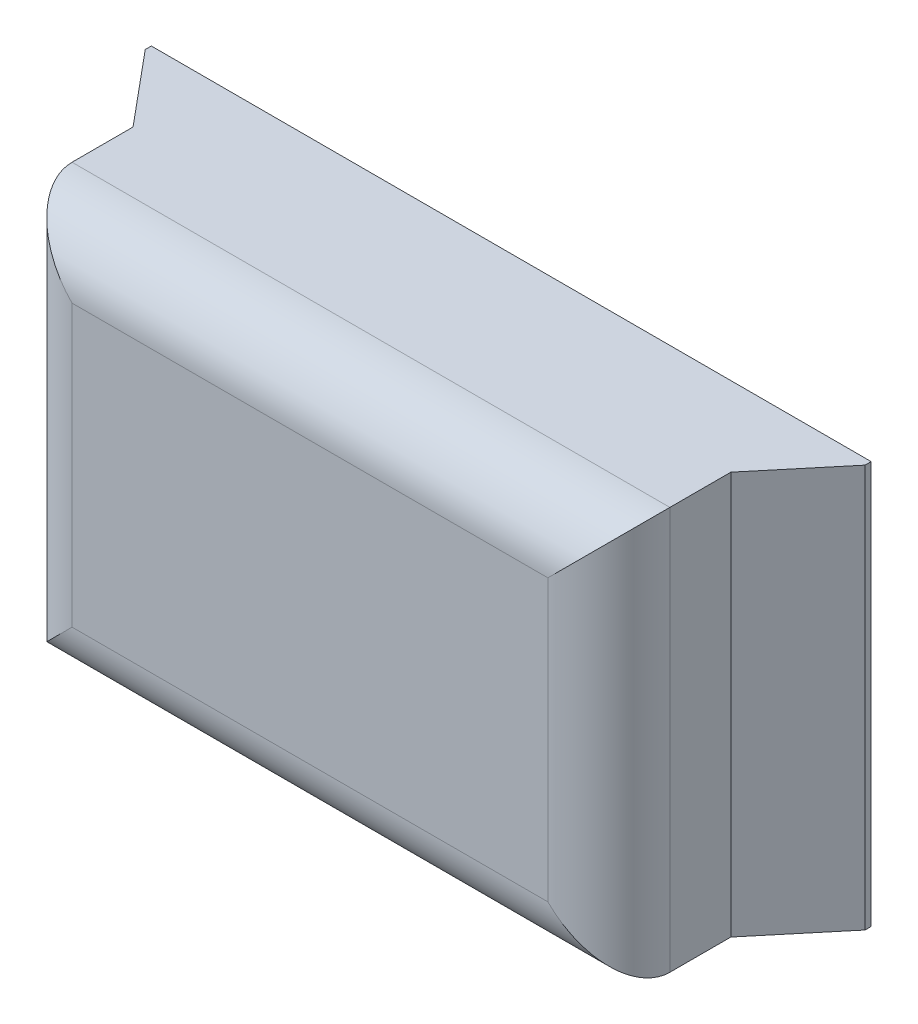
ISO-10303-21;
HEADER;
FILE_DESCRIPTION(('STEP AP214'),'2;1');
FILE_NAME('part.step','',(''),(''),'','','');
FILE_SCHEMA(('AUTOMOTIVE_DESIGN { 1 0 10303 214 1 1 1 1 }'));
ENDSEC;
DATA;
#1=APPLICATION_CONTEXT('core data for automotive mechanical design processes');
#2=APPLICATION_PROTOCOL_DEFINITION('international standard','automotive_design',2000,#1);
#3=PRODUCT_CONTEXT('',#1,'mechanical');
#4=PRODUCT('Part','Part','',(#3));
#5=PRODUCT_RELATED_PRODUCT_CATEGORY('part','',(#4));
#6=PRODUCT_DEFINITION_FORMATION('','',#4);
#7=PRODUCT_DEFINITION_CONTEXT('part definition',#1,'design');
#8=PRODUCT_DEFINITION('design','',#6,#7);
#9=PRODUCT_DEFINITION_SHAPE('','',#8);
#10=(LENGTH_UNIT() NAMED_UNIT(*) SI_UNIT(.MILLI.,.METRE.));
#11=(NAMED_UNIT(*) PLANE_ANGLE_UNIT() SI_UNIT($,.RADIAN.));
#12=(NAMED_UNIT(*) SI_UNIT($,.STERADIAN.) SOLID_ANGLE_UNIT());
#13=UNCERTAINTY_MEASURE_WITH_UNIT(LENGTH_MEASURE(1.E-05),#10,'distance_accuracy_value','');
#14=(GEOMETRIC_REPRESENTATION_CONTEXT(3) GLOBAL_UNCERTAINTY_ASSIGNED_CONTEXT((#13)) GLOBAL_UNIT_ASSIGNED_CONTEXT((#10,
#11,#12)) REPRESENTATION_CONTEXT('',''));
#15=CARTESIAN_POINT('',(0.,0.,0.));
#16=DIRECTION('',(0.,0.,1.));
#17=DIRECTION('',(1.,0.,0.));
#18=AXIS2_PLACEMENT_3D('',#15,#16,#17);
#19=CARTESIAN_POINT('',(-13.7543906913886,3.3,7.29759578596647));
#20=DIRECTION('',(-1.,0.,0.));
#21=DIRECTION('',(0.,0.,1.));
#22=AXIS2_PLACEMENT_3D('',#19,#20,#21);
#23=PLANE('',#22);
#24=DIRECTION('',(0.,0.,-1.));
#25=VECTOR('',#24,1.);
#26=CARTESIAN_POINT('',(-13.7543906913886,0.,7.29759578596647));
#27=LINE('',#26,#25);
#28=CARTESIAN_POINT('',(-13.7543906913886,0.,7.29759578596647));
#29=VERTEX_POINT('',#28);
#30=CARTESIAN_POINT('',(-13.7543906913886,0.,7.24759578596647));
#31=VERTEX_POINT('',#30);
#32=EDGE_CURVE('E218',#29,#31,#27,.T.);
#33=ORIENTED_EDGE('',*,*,#32,.T.);
#34=DIRECTION('',(0.,-1.,0.));
#35=VECTOR('',#34,1.);
#36=CARTESIAN_POINT('',(-13.7543906913886,3.3,7.24759578596647));
#37=LINE('',#36,#35);
#38=CARTESIAN_POINT('',(-13.7543906913886,3.3,7.24759578596647));
#39=VERTEX_POINT('',#38);
#40=EDGE_CURVE('E259',#39,#31,#37,.T.);
#41=ORIENTED_EDGE('',*,*,#40,.F.);
#42=DIRECTION('',(0.,0.,-1.));
#43=VECTOR('',#42,1.);
#44=CARTESIAN_POINT('',(-13.7543906913886,3.3,7.29759578596647));
#45=LINE('',#44,#43);
#46=CARTESIAN_POINT('',(-13.7543906913886,3.3,7.29759578596647));
#47=VERTEX_POINT('',#46);
#48=EDGE_CURVE('E193',#47,#39,#45,.T.);
#49=ORIENTED_EDGE('',*,*,#48,.F.);
#50=DIRECTION('',(0.,-1.,0.));
#51=VECTOR('',#50,1.);
#52=CARTESIAN_POINT('',(-13.7543906913886,3.3,7.29759578596647));
#53=LINE('',#52,#51);
#54=EDGE_CURVE('E217',#47,#29,#53,.T.);
#55=ORIENTED_EDGE('',*,*,#54,.T.);
#56=EDGE_LOOP('',(#33,#41,#49,#55));
#57=FACE_BOUND('',#56,.T.);
#58=ADVANCED_FACE('F39',(#57),#23,.F.);
#59=CARTESIAN_POINT('',(-19.6543906913886,3.3,7.24759578596647));
#60=DIRECTION('',(0.,0.,1.));
#61=DIRECTION('',(1.,0.,0.));
#62=AXIS2_PLACEMENT_3D('',#59,#60,#61);
#63=PLANE('',#62);
#64=DIRECTION('',(1.,0.,0.));
#65=VECTOR('',#64,1.);
#66=CARTESIAN_POINT('',(-15.4685901624182,2.75004940079036,7.24759578596647));
#67=LINE('',#66,#65);
#68=CARTESIAN_POINT('',(-17.9401912203589,2.75004940079036,7.24759578596647));
#69=VERTEX_POINT('',#68);
#70=CARTESIAN_POINT('',(-15.4685901624182,2.75004940079036,7.24759578596647));
#71=VERTEX_POINT('',#70);
#72=EDGE_CURVE('E178',#69,#71,#67,.T.);
#73=ORIENTED_EDGE('',*,*,#72,.F.);
#74=DIRECTION('',(0.,1.,0.));
#75=VECTOR('',#74,1.);
#76=CARTESIAN_POINT('',(-17.9401912203589,2.75004940079036,7.24759578596647));
#77=LINE('',#76,#75);
#78=CARTESIAN_POINT('',(-17.9401912203589,0.549950599209641,7.24759578596647));
#79=VERTEX_POINT('',#78);
#80=EDGE_CURVE('E57',#79,#69,#77,.T.);
#81=ORIENTED_EDGE('',*,*,#80,.F.);
#82=DIRECTION('',(-1.,0.,0.));
#83=VECTOR('',#82,1.);
#84=CARTESIAN_POINT('',(-15.4685901624182,0.549950599209641,7.24759578596647));
#85=LINE('',#84,#83);
#86=CARTESIAN_POINT('',(-15.4685901624182,0.549950599209641,7.24759578596647));
#87=VERTEX_POINT('',#86);
#88=EDGE_CURVE('E165',#87,#79,#85,.T.);
#89=ORIENTED_EDGE('',*,*,#88,.F.);
#90=DIRECTION('',(0.,-1.,0.));
#91=VECTOR('',#90,1.);
#92=CARTESIAN_POINT('',(-15.4685901624182,2.75004940079036,7.24759578596647));
#93=LINE('',#92,#91);
#94=EDGE_CURVE('E169',#71,#87,#93,.T.);
#95=ORIENTED_EDGE('',*,*,#94,.F.);
#96=EDGE_LOOP('',(#73,#81,#89,#95));
#97=FACE_BOUND('',#96,.T.);
#98=DIRECTION('',(-1.,0.,0.));
#99=VECTOR('',#98,1.);
#100=CARTESIAN_POINT('',(-19.6543906913886,0.,7.24759578596647));
#101=LINE('',#100,#99);
#102=CARTESIAN_POINT('',(-19.6543906913886,0.,7.24759578596647));
#103=VERTEX_POINT('',#102);
#104=EDGE_CURVE('E222',#31,#103,#101,.T.);
#105=ORIENTED_EDGE('',*,*,#104,.T.);
#106=DIRECTION('',(0.,-1.,0.));
#107=VECTOR('',#106,1.);
#108=CARTESIAN_POINT('',(-19.6543906913886,3.3,7.24759578596647));
#109=LINE('',#108,#107);
#110=CARTESIAN_POINT('',(-19.6543906913886,3.3,7.24759578596647));
#111=VERTEX_POINT('',#110);
#112=EDGE_CURVE('E255',#111,#103,#109,.T.);
#113=ORIENTED_EDGE('',*,*,#112,.F.);
#114=DIRECTION('',(-1.,0.,0.));
#115=VECTOR('',#114,1.);
#116=CARTESIAN_POINT('',(-19.6543906913886,3.3,7.24759578596647));
#117=LINE('',#116,#115);
#118=EDGE_CURVE('E197',#39,#111,#117,.T.);
#119=ORIENTED_EDGE('',*,*,#118,.F.);
#120=ORIENTED_EDGE('',*,*,#40,.T.);
#121=EDGE_LOOP('',(#105,#113,#119,#120));
#122=FACE_BOUND('',#121,.T.);
#123=ADVANCED_FACE('F335',(#97,#122),#63,.F.);
#124=CARTESIAN_POINT('',(-19.6543906913886,3.3,7.29759578596647));
#125=DIRECTION('',(1.,0.,0.));
#126=DIRECTION('',(0.,0.,-1.));
#127=AXIS2_PLACEMENT_3D('',#124,#125,#126);
#128=PLANE('',#127);
#129=DIRECTION('',(0.,0.,1.));
#130=VECTOR('',#129,1.);
#131=CARTESIAN_POINT('',(-19.6543906913886,0.,7.29759578596647));
#132=LINE('',#131,#130);
#133=CARTESIAN_POINT('',(-19.6543906913886,0.,7.29759578596647));
#134=VERTEX_POINT('',#133);
#135=EDGE_CURVE('E225',#103,#134,#132,.T.);
#136=ORIENTED_EDGE('',*,*,#135,.T.);
#137=DIRECTION('',(0.,-1.,0.));
#138=VECTOR('',#137,1.);
#139=CARTESIAN_POINT('',(-19.6543906913886,3.3,7.29759578596647));
#140=LINE('',#139,#138);
#141=CARTESIAN_POINT('',(-19.6543906913886,3.3,7.29759578596647));
#142=VERTEX_POINT('',#141);
#143=EDGE_CURVE('E251',#142,#134,#140,.T.);
#144=ORIENTED_EDGE('',*,*,#143,.F.);
#145=DIRECTION('',(0.,0.,1.));
#146=VECTOR('',#145,1.);
#147=CARTESIAN_POINT('',(-19.6543906913886,3.3,7.29759578596647));
#148=LINE('',#147,#146);
#149=EDGE_CURVE('E201',#111,#142,#148,.T.);
#150=ORIENTED_EDGE('',*,*,#149,.F.);
#151=ORIENTED_EDGE('',*,*,#112,.T.);
#152=EDGE_LOOP('',(#136,#144,#150,#151));
#153=FACE_BOUND('',#152,.T.);
#154=ADVANCED_FACE('F341',(#153),#128,.F.);
#155=CARTESIAN_POINT('',(-19.1543906913886,3.3,7.89759578596646));
#156=DIRECTION('',(0.76822127959737,0.,-0.640184399664487));
#157=DIRECTION('',(-0.640184399664487,0.,-0.76822127959737));
#158=AXIS2_PLACEMENT_3D('',#155,#156,#157);
#159=PLANE('',#158);
#160=DIRECTION('',(0.640184399664487,0.,0.76822127959737));
#161=VECTOR('',#160,1.);
#162=CARTESIAN_POINT('',(-19.1543906913886,0.,7.89759578596646));
#163=LINE('',#162,#161);
#164=CARTESIAN_POINT('',(-19.1543906913886,0.,7.89759578596646));
#165=VERTEX_POINT('',#164);
#166=EDGE_CURVE('E228',#134,#165,#163,.T.);
#167=ORIENTED_EDGE('',*,*,#166,.T.);
#168=DIRECTION('',(0.,-1.,0.));
#169=VECTOR('',#168,1.);
#170=CARTESIAN_POINT('',(-19.1543906913886,3.3,7.89759578596646));
#171=LINE('',#170,#169);
#172=CARTESIAN_POINT('',(-19.1543906913886,3.3,7.89759578596646));
#173=VERTEX_POINT('',#172);
#174=EDGE_CURVE('E247',#173,#165,#171,.T.);
#175=ORIENTED_EDGE('',*,*,#174,.F.);
#176=DIRECTION('',(0.640184399664487,0.,0.76822127959737));
#177=VECTOR('',#176,1.);
#178=CARTESIAN_POINT('',(-19.1543906913886,3.3,7.89759578596646));
#179=LINE('',#178,#177);
#180=EDGE_CURVE('E204',#142,#173,#179,.T.);
#181=ORIENTED_EDGE('',*,*,#180,.F.);
#182=ORIENTED_EDGE('',*,*,#143,.T.);
#183=EDGE_LOOP('',(#167,#175,#181,#182));
#184=FACE_BOUND('',#183,.T.);
#185=ADVANCED_FACE('F332',(#184),#159,.F.);
#186=CARTESIAN_POINT('',(-19.1543906913886,3.3,7.89759578596646));
#187=DIRECTION('',(1.,0.,0.));
#188=DIRECTION('',(0.,0.,-1.));
#189=AXIS2_PLACEMENT_3D('',#186,#187,#188);
#190=PLANE('',#189);
#191=DIRECTION('',(0.,0.,1.));
#192=VECTOR('',#191,1.);
#193=CARTESIAN_POINT('',(-19.1543906913886,0.,7.89759578596646));
#194=LINE('',#193,#192);
#195=CARTESIAN_POINT('',(-19.1543906913886,0.,8.39759578596647));
#196=VERTEX_POINT('',#195);
#197=EDGE_CURVE('E231',#165,#196,#194,.T.);
#198=ORIENTED_EDGE('',*,*,#197,.T.);
#199=DIRECTION('',(0.,-1.,0.));
#200=VECTOR('',#199,1.);
#201=CARTESIAN_POINT('',(-19.1543906913886,3.3,8.39759578596647));
#202=LINE('',#201,#200);
#203=CARTESIAN_POINT('',(-19.1543906913886,3.3,8.39759578596647));
#204=VERTEX_POINT('',#203);
#205=EDGE_CURVE('E276',#196,#204,#202,.F.);
#206=ORIENTED_EDGE('',*,*,#205,.T.);
#207=DIRECTION('',(0.,0.,1.));
#208=VECTOR('',#207,1.);
#209=CARTESIAN_POINT('',(-19.1543906913886,3.3,7.89759578596646));
#210=LINE('',#209,#208);
#211=EDGE_CURVE('E207',#173,#204,#210,.T.);
#212=ORIENTED_EDGE('',*,*,#211,.F.);
#213=ORIENTED_EDGE('',*,*,#174,.T.);
#214=EDGE_LOOP('',(#198,#206,#212,#213));
#215=FACE_BOUND('',#214,.T.);
#216=ADVANCED_FACE('F315',(#215),#190,.F.);
#217=CARTESIAN_POINT('',(-19.1543906913886,3.3,8.89759578596647));
#218=DIRECTION('',(0.,0.,-1.));
#219=DIRECTION('',(-1.,0.,0.));
#220=AXIS2_PLACEMENT_3D('',#217,#218,#219);
#221=PLANE('',#220);
#222=DIRECTION('',(1.,0.,0.));
#223=VECTOR('',#222,1.);
#224=CARTESIAN_POINT('',(-19.1543906913886,2.8,8.89759578596647));
#225=LINE('',#224,#223);
#226=CARTESIAN_POINT('',(-14.7543906913886,2.8,8.89759578596647));
#227=VERTEX_POINT('',#226);
#228=CARTESIAN_POINT('',(-18.6543906913886,2.8,8.89759578596647));
#229=VERTEX_POINT('',#228);
#230=EDGE_CURVE('E269',#227,#229,#225,.F.);
#231=ORIENTED_EDGE('',*,*,#230,.T.);
#232=DIRECTION('',(0.,-1.,0.));
#233=VECTOR('',#232,1.);
#234=CARTESIAN_POINT('',(-18.6543906913886,3.3,8.89759578596647));
#235=LINE('',#234,#233);
#236=CARTESIAN_POINT('',(-18.6543906913886,0.5,8.89759578596647));
#237=VERTEX_POINT('',#236);
#238=EDGE_CURVE('E272',#229,#237,#235,.T.);
#239=ORIENTED_EDGE('',*,*,#238,.T.);
#240=DIRECTION('',(1.,0.,0.));
#241=VECTOR('',#240,1.);
#242=CARTESIAN_POINT('',(-14.2543906913886,0.5,8.89759578596647));
#243=LINE('',#242,#241);
#244=CARTESIAN_POINT('',(-14.7543906913886,0.5,8.89759578596647));
#245=VERTEX_POINT('',#244);
#246=EDGE_CURVE('E263',#237,#245,#243,.T.);
#247=ORIENTED_EDGE('',*,*,#246,.T.);
#248=DIRECTION('',(0.,-1.,0.));
#249=VECTOR('',#248,1.);
#250=CARTESIAN_POINT('',(-14.7543906913886,3.3,8.89759578596647));
#251=LINE('',#250,#249);
#252=EDGE_CURVE('E266',#245,#227,#251,.F.);
#253=ORIENTED_EDGE('',*,*,#252,.T.);
#254=EDGE_LOOP('',(#231,#239,#247,#253));
#255=FACE_BOUND('',#254,.T.);
#256=ADVANCED_FACE('F322',(#255),#221,.F.);
#257=CARTESIAN_POINT('',(-14.2543906913886,3.3,7.89759578596646));
#258=DIRECTION('',(-1.,0.,0.));
#259=DIRECTION('',(0.,0.,1.));
#260=AXIS2_PLACEMENT_3D('',#257,#258,#259);
#261=PLANE('',#260);
#262=DIRECTION('',(0.,0.,-1.));
#263=VECTOR('',#262,1.);
#264=CARTESIAN_POINT('',(-14.2543906913886,3.3,7.89759578596646));
#265=LINE('',#264,#263);
#266=CARTESIAN_POINT('',(-14.2543906913886,3.3,8.39759578596647));
#267=VERTEX_POINT('',#266);
#268=CARTESIAN_POINT('',(-14.2543906913886,3.3,7.89759578596646));
#269=VERTEX_POINT('',#268);
#270=EDGE_CURVE('E211',#267,#269,#265,.T.);
#271=ORIENTED_EDGE('',*,*,#270,.F.);
#272=DIRECTION('',(0.,-1.,0.));
#273=VECTOR('',#272,1.);
#274=CARTESIAN_POINT('',(-14.2543906913886,3.3,8.39759578596647));
#275=LINE('',#274,#273);
#276=CARTESIAN_POINT('',(-14.2543906913886,0.,8.39759578596647));
#277=VERTEX_POINT('',#276);
#278=EDGE_CURVE('E49',#267,#277,#275,.T.);
#279=ORIENTED_EDGE('',*,*,#278,.T.);
#280=DIRECTION('',(0.,0.,-1.));
#281=VECTOR('',#280,1.);
#282=CARTESIAN_POINT('',(-14.2543906913886,0.,7.89759578596646));
#283=LINE('',#282,#281);
#284=CARTESIAN_POINT('',(-14.2543906913886,0.,7.89759578596646));
#285=VERTEX_POINT('',#284);
#286=EDGE_CURVE('E235',#277,#285,#283,.T.);
#287=ORIENTED_EDGE('',*,*,#286,.T.);
#288=DIRECTION('',(0.,-1.,0.));
#289=VECTOR('',#288,1.);
#290=CARTESIAN_POINT('',(-14.2543906913886,3.3,7.89759578596646));
#291=LINE('',#290,#289);
#292=EDGE_CURVE('E243',#269,#285,#291,.T.);
#293=ORIENTED_EDGE('',*,*,#292,.F.);
#294=EDGE_LOOP('',(#271,#279,#287,#293));
#295=FACE_BOUND('',#294,.T.);
#296=ADVANCED_FACE('F324',(#295),#261,.F.);
#297=CARTESIAN_POINT('',(-14.2543906913886,3.3,7.89759578596646));
#298=DIRECTION('',(-0.76822127959737,0.,-0.640184399664487));
#299=DIRECTION('',(-0.640184399664487,0.,0.76822127959737));
#300=AXIS2_PLACEMENT_3D('',#297,#298,#299);
#301=PLANE('',#300);
#302=DIRECTION('',(0.640184399664487,0.,-0.76822127959737));
#303=VECTOR('',#302,1.);
#304=CARTESIAN_POINT('',(-14.2543906913886,0.,7.89759578596646));
#305=LINE('',#304,#303);
#306=EDGE_CURVE('E198',#285,#29,#305,.T.);
#307=ORIENTED_EDGE('',*,*,#306,.T.);
#308=ORIENTED_EDGE('',*,*,#54,.F.);
#309=DIRECTION('',(0.640184399664487,0.,-0.76822127959737));
#310=VECTOR('',#309,1.);
#311=CARTESIAN_POINT('',(-14.2543906913886,3.3,7.89759578596646));
#312=LINE('',#311,#310);
#313=EDGE_CURVE('E214',#269,#47,#312,.T.);
#314=ORIENTED_EDGE('',*,*,#313,.F.);
#315=ORIENTED_EDGE('',*,*,#292,.T.);
#316=EDGE_LOOP('',(#307,#308,#314,#315));
#317=FACE_BOUND('',#316,.T.);
#318=ADVANCED_FACE('F330',(#317),#301,.F.);
#319=CARTESIAN_POINT('',(0.,3.3,0.));
#320=DIRECTION('',(0.,-1.,0.));
#321=DIRECTION('',(0.,0.,-1.));
#322=AXIS2_PLACEMENT_3D('',#319,#320,#321);
#323=PLANE('',#322);
#324=ORIENTED_EDGE('',*,*,#211,.T.);
#325=DIRECTION('',(1.,0.,0.));
#326=VECTOR('',#325,1.);
#327=CARTESIAN_POINT('',(0.,3.3,8.39759578596647));
#328=LINE('',#327,#326);
#329=EDGE_CURVE('E280',#204,#267,#328,.T.);
#330=ORIENTED_EDGE('',*,*,#329,.T.);
#331=ORIENTED_EDGE('',*,*,#270,.T.);
#332=ORIENTED_EDGE('',*,*,#313,.T.);
#333=ORIENTED_EDGE('',*,*,#48,.T.);
#334=ORIENTED_EDGE('',*,*,#118,.T.);
#335=ORIENTED_EDGE('',*,*,#149,.T.);
#336=ORIENTED_EDGE('',*,*,#180,.T.);
#337=EDGE_LOOP('',(#324,#330,#331,#332,#333,#334,#335,#336));
#338=FACE_BOUND('',#337,.T.);
#339=ADVANCED_FACE('F356',(#338),#323,.F.);
#340=CARTESIAN_POINT('',(0.,0.,0.));
#341=DIRECTION('',(0.,-1.,0.));
#342=DIRECTION('',(0.,0.,-1.));
#343=AXIS2_PLACEMENT_3D('',#340,#341,#342);
#344=PLANE('',#343);
#345=ORIENTED_EDGE('',*,*,#286,.F.);
#346=DIRECTION('',(1.,0.,0.));
#347=VECTOR('',#346,1.);
#348=CARTESIAN_POINT('',(-19.1543906913886,0.,8.39759578596647));
#349=LINE('',#348,#347);
#350=EDGE_CURVE('E11',#277,#196,#349,.F.);
#351=ORIENTED_EDGE('',*,*,#350,.T.);
#352=ORIENTED_EDGE('',*,*,#197,.F.);
#353=ORIENTED_EDGE('',*,*,#166,.F.);
#354=ORIENTED_EDGE('',*,*,#135,.F.);
#355=ORIENTED_EDGE('',*,*,#104,.F.);
#356=ORIENTED_EDGE('',*,*,#32,.F.);
#357=ORIENTED_EDGE('',*,*,#306,.F.);
#358=EDGE_LOOP('',(#345,#351,#352,#353,#354,#355,#356,#357));
#359=FACE_BOUND('',#358,.T.);
#360=ADVANCED_FACE('F310',(#359),#344,.T.);
#361=CARTESIAN_POINT('',(-14.7543906913886,3.3,8.39759578596647));
#362=DIRECTION('',(0.,-1.,0.));
#363=DIRECTION('',(0.,0.,-1.));
#364=AXIS2_PLACEMENT_3D('',#361,#362,#363);
#365=CYLINDRICAL_SURFACE('',#364,0.5);
#366=CARTESIAN_POINT('',(-14.7543906913886,0.5,8.39759578596647));
#367=DIRECTION('',(-0.707106781186547,-0.707106781186547,0.));
#368=DIRECTION('',(-0.707106781186547,0.707106781186547,0.));
#369=AXIS2_PLACEMENT_3D('',#366,#367,#368);
#370=ELLIPSE('',#369,0.707106781186547,0.5);
#371=EDGE_CURVE('E289',#277,#245,#370,.T.);
#372=ORIENTED_EDGE('',*,*,#371,.F.);
#373=ORIENTED_EDGE('',*,*,#278,.F.);
#374=CARTESIAN_POINT('',(-14.7543906913886,2.8,8.39759578596647));
#375=DIRECTION('',(0.707106781186547,-0.707106781186547,0.));
#376=DIRECTION('',(-0.707106781186547,-0.707106781186547,0.));
#377=AXIS2_PLACEMENT_3D('',#374,#375,#376);
#378=ELLIPSE('',#377,0.707106781186547,0.5);
#379=EDGE_CURVE('E43',#227,#267,#378,.F.);
#380=ORIENTED_EDGE('',*,*,#379,.F.);
#381=ORIENTED_EDGE('',*,*,#252,.F.);
#382=EDGE_LOOP('',(#372,#373,#380,#381));
#383=FACE_BOUND('',#382,.T.);
#384=ADVANCED_FACE('F41',(#383),#365,.T.);
#385=CARTESIAN_POINT('',(0.,2.8,8.39759578596647));
#386=DIRECTION('',(1.,0.,0.));
#387=DIRECTION('',(0.,0.,-1.));
#388=AXIS2_PLACEMENT_3D('',#385,#386,#387);
#389=CYLINDRICAL_SURFACE('',#388,0.5);
#390=ORIENTED_EDGE('',*,*,#379,.T.);
#391=ORIENTED_EDGE('',*,*,#329,.F.);
#392=CARTESIAN_POINT('',(-18.6543906913886,2.8,8.39759578596647));
#393=DIRECTION('',(0.707106781186547,0.707106781186547,0.));
#394=DIRECTION('',(0.707106781186547,-0.707106781186547,0.));
#395=AXIS2_PLACEMENT_3D('',#392,#393,#394);
#396=ELLIPSE('',#395,0.707106781186547,0.5);
#397=EDGE_CURVE('E287',#229,#204,#396,.F.);
#398=ORIENTED_EDGE('',*,*,#397,.F.);
#399=ORIENTED_EDGE('',*,*,#230,.F.);
#400=EDGE_LOOP('',(#390,#391,#398,#399));
#401=FACE_BOUND('',#400,.T.);
#402=ADVANCED_FACE('F302',(#401),#389,.T.);
#403=CARTESIAN_POINT('',(-19.1543906913886,0.5,8.39759578596647));
#404=DIRECTION('',(-1.,0.,0.));
#405=DIRECTION('',(0.,0.,1.));
#406=AXIS2_PLACEMENT_3D('',#403,#404,#405);
#407=CYLINDRICAL_SURFACE('',#406,0.5);
#408=ORIENTED_EDGE('',*,*,#371,.T.);
#409=ORIENTED_EDGE('',*,*,#246,.F.);
#410=CARTESIAN_POINT('',(-18.6543906913886,0.5,8.39759578596647));
#411=DIRECTION('',(-0.707106781186547,0.707106781186547,0.));
#412=DIRECTION('',(-0.707106781186547,-0.707106781186547,0.));
#413=AXIS2_PLACEMENT_3D('',#410,#411,#412);
#414=ELLIPSE('',#413,0.707106781186547,0.5);
#415=EDGE_CURVE('E187',#196,#237,#414,.T.);
#416=ORIENTED_EDGE('',*,*,#415,.F.);
#417=ORIENTED_EDGE('',*,*,#350,.F.);
#418=EDGE_LOOP('',(#408,#409,#416,#417));
#419=FACE_BOUND('',#418,.T.);
#420=ADVANCED_FACE('F307',(#419),#407,.T.);
#421=CARTESIAN_POINT('',(-18.6543906913886,3.3,8.39759578596647));
#422=DIRECTION('',(0.,-1.,0.));
#423=DIRECTION('',(0.,0.,-1.));
#424=AXIS2_PLACEMENT_3D('',#421,#422,#423);
#425=CYLINDRICAL_SURFACE('',#424,0.5);
#426=ORIENTED_EDGE('',*,*,#397,.T.);
#427=ORIENTED_EDGE('',*,*,#205,.F.);
#428=ORIENTED_EDGE('',*,*,#415,.T.);
#429=ORIENTED_EDGE('',*,*,#238,.F.);
#430=EDGE_LOOP('',(#426,#427,#428,#429));
#431=FACE_BOUND('',#430,.T.);
#432=ADVANCED_FACE('F319',(#431),#425,.T.);
#433=CARTESIAN_POINT('',(-17.9401912203589,2.75004940079036,7.70759578596647));
#434=DIRECTION('',(-1.,0.,0.));
#435=DIRECTION('',(0.,0.,1.));
#436=AXIS2_PLACEMENT_3D('',#433,#434,#435);
#437=PLANE('',#436);
#438=ORIENTED_EDGE('',*,*,#80,.T.);
#439=DIRECTION('',(0.,0.,-1.));
#440=VECTOR('',#439,1.);
#441=CARTESIAN_POINT('',(-17.9401912203589,2.75004940079036,7.70759578596647));
#442=LINE('',#441,#440);
#443=CARTESIAN_POINT('',(-17.9401912203589,2.75004940079036,7.70759578596647));
#444=VERTEX_POINT('',#443);
#445=EDGE_CURVE('E140',#444,#69,#442,.T.);
#446=ORIENTED_EDGE('',*,*,#445,.F.);
#447=DIRECTION('',(0.,1.,0.));
#448=VECTOR('',#447,1.);
#449=CARTESIAN_POINT('',(-17.9401912203589,2.75004940079036,7.70759578596647));
#450=LINE('',#449,#448);
#451=CARTESIAN_POINT('',(-17.9401912203589,0.549950599209641,7.70759578596647));
#452=VERTEX_POINT('',#451);
#453=EDGE_CURVE('E144',#452,#444,#450,.T.);
#454=ORIENTED_EDGE('',*,*,#453,.F.);
#455=DIRECTION('',(0.,0.,-1.));
#456=VECTOR('',#455,1.);
#457=CARTESIAN_POINT('',(-17.9401912203589,0.549950599209641,7.70759578596647));
#458=LINE('',#457,#456);
#459=EDGE_CURVE('E184',#452,#79,#458,.T.);
#460=ORIENTED_EDGE('',*,*,#459,.T.);
#461=EDGE_LOOP('',(#438,#446,#454,#460));
#462=FACE_BOUND('',#461,.T.);
#463=ADVANCED_FACE('F142',(#462),#437,.F.);
#464=CARTESIAN_POINT('',(-15.4685901624182,0.549950599209641,7.70759578596647));
#465=DIRECTION('',(0.,-1.,0.));
#466=DIRECTION('',(0.,0.,-1.));
#467=AXIS2_PLACEMENT_3D('',#464,#465,#466);
#468=PLANE('',#467);
#469=ORIENTED_EDGE('',*,*,#88,.T.);
#470=ORIENTED_EDGE('',*,*,#459,.F.);
#471=DIRECTION('',(-1.,0.,0.));
#472=VECTOR('',#471,1.);
#473=CARTESIAN_POINT('',(-15.4685901624182,0.549950599209641,7.70759578596647));
#474=LINE('',#473,#472);
#475=CARTESIAN_POINT('',(-15.4685901624182,0.549950599209641,7.70759578596647));
#476=VERTEX_POINT('',#475);
#477=EDGE_CURVE('E151',#476,#452,#474,.T.);
#478=ORIENTED_EDGE('',*,*,#477,.F.);
#479=DIRECTION('',(0.,0.,-1.));
#480=VECTOR('',#479,1.);
#481=CARTESIAN_POINT('',(-15.4685901624182,0.549950599209641,7.70759578596647));
#482=LINE('',#481,#480);
#483=EDGE_CURVE('E188',#476,#87,#482,.T.);
#484=ORIENTED_EDGE('',*,*,#483,.T.);
#485=EDGE_LOOP('',(#469,#470,#478,#484));
#486=FACE_BOUND('',#485,.T.);
#487=ADVANCED_FACE('F453',(#486),#468,.F.);
#488=CARTESIAN_POINT('',(-15.4685901624182,2.75004940079036,7.70759578596647));
#489=DIRECTION('',(1.,0.,0.));
#490=DIRECTION('',(0.,0.,-1.));
#491=AXIS2_PLACEMENT_3D('',#488,#489,#490);
#492=PLANE('',#491);
#493=ORIENTED_EDGE('',*,*,#94,.T.);
#494=ORIENTED_EDGE('',*,*,#483,.F.);
#495=DIRECTION('',(0.,-1.,0.));
#496=VECTOR('',#495,1.);
#497=CARTESIAN_POINT('',(-15.4685901624182,2.75004940079036,7.70759578596647));
#498=LINE('',#497,#496);
#499=CARTESIAN_POINT('',(-15.4685901624182,2.75004940079036,7.70759578596647));
#500=VERTEX_POINT('',#499);
#501=EDGE_CURVE('E160',#500,#476,#498,.T.);
#502=ORIENTED_EDGE('',*,*,#501,.F.);
#503=DIRECTION('',(0.,0.,-1.));
#504=VECTOR('',#503,1.);
#505=CARTESIAN_POINT('',(-15.4685901624182,2.75004940079036,7.70759578596647));
#506=LINE('',#505,#504);
#507=EDGE_CURVE('E150',#500,#71,#506,.T.);
#508=ORIENTED_EDGE('',*,*,#507,.T.);
#509=EDGE_LOOP('',(#493,#494,#502,#508));
#510=FACE_BOUND('',#509,.T.);
#511=ADVANCED_FACE('F461',(#510),#492,.F.);
#512=CARTESIAN_POINT('',(-15.4685901624182,2.75004940079036,7.70759578596647));
#513=DIRECTION('',(0.,1.,0.));
#514=DIRECTION('',(0.,0.,1.));
#515=AXIS2_PLACEMENT_3D('',#512,#513,#514);
#516=PLANE('',#515);
#517=ORIENTED_EDGE('',*,*,#72,.T.);
#518=ORIENTED_EDGE('',*,*,#507,.F.);
#519=DIRECTION('',(1.,0.,0.));
#520=VECTOR('',#519,1.);
#521=CARTESIAN_POINT('',(-15.4685901624182,2.75004940079036,7.70759578596647));
#522=LINE('',#521,#520);
#523=EDGE_CURVE('E154',#444,#500,#522,.T.);
#524=ORIENTED_EDGE('',*,*,#523,.F.);
#525=ORIENTED_EDGE('',*,*,#445,.T.);
#526=EDGE_LOOP('',(#517,#518,#524,#525));
#527=FACE_BOUND('',#526,.T.);
#528=ADVANCED_FACE('F155',(#527),#516,.F.);
#529=CARTESIAN_POINT('',(0.,0.,7.70759578596647));
#530=DIRECTION('',(0.,0.,-1.));
#531=DIRECTION('',(-1.,0.,0.));
#532=AXIS2_PLACEMENT_3D('',#529,#530,#531);
#533=PLANE('',#532);
#534=ORIENTED_EDGE('',*,*,#453,.T.);
#535=ORIENTED_EDGE('',*,*,#523,.T.);
#536=ORIENTED_EDGE('',*,*,#501,.T.);
#537=ORIENTED_EDGE('',*,*,#477,.T.);
#538=EDGE_LOOP('',(#534,#535,#536,#537));
#539=FACE_BOUND('',#538,.T.);
#540=ADVANCED_FACE('F162',(#539),#533,.T.);
#541=CLOSED_SHELL('',(#58,#123,#154,#185,#216,#256,#296,#318,#339,#360,#384,#402,#420,#432,#463,
#487,#511,#528,#540));
#542=MANIFOLD_SOLID_BREP('B2',#541);
#543=ADVANCED_BREP_SHAPE_REPRESENTATION('',(#18,#542),#14);
#544=SHAPE_DEFINITION_REPRESENTATION(#9,#543);
ENDSEC;
END-ISO-10303-21;
